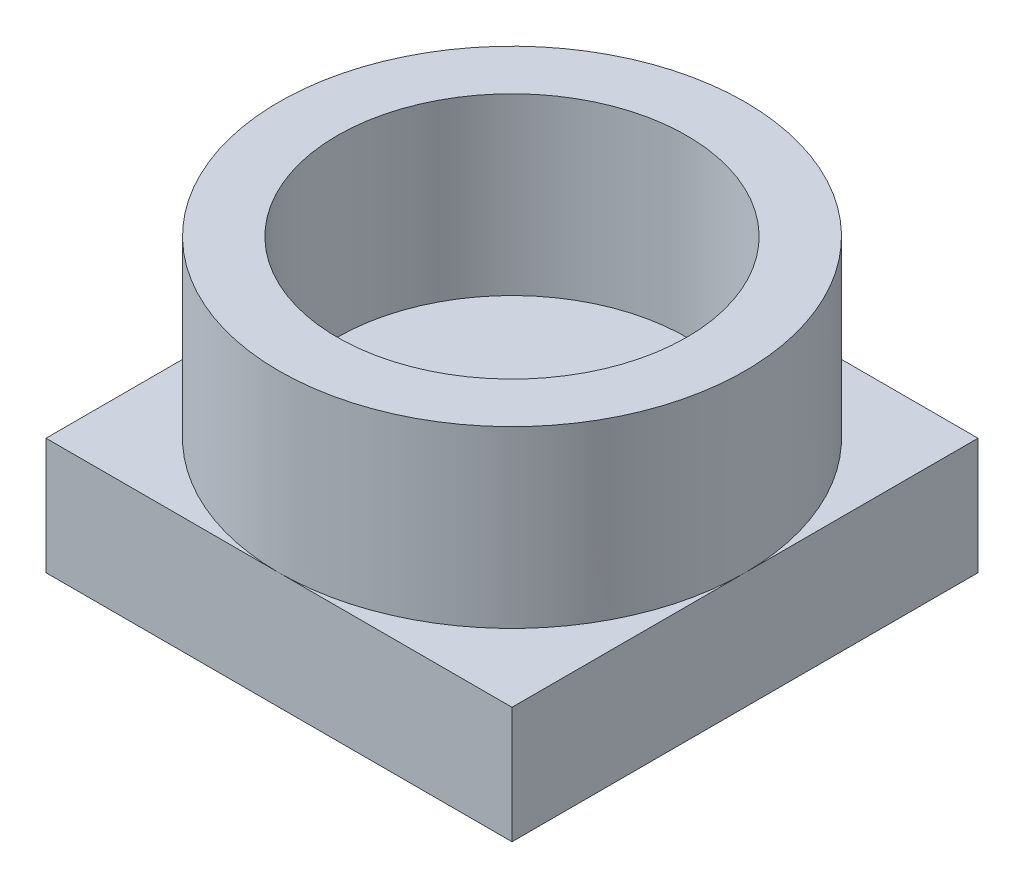
ISO-10303-21;
HEADER;
FILE_DESCRIPTION(('STEP AP214'),'2;1');
FILE_NAME('part.step','',(''),(''),'','','');
FILE_SCHEMA(('AUTOMOTIVE_DESIGN { 1 0 10303 214 1 1 1 1 }'));
ENDSEC;
DATA;
#1=APPLICATION_CONTEXT('core data for automotive mechanical design processes');
#2=APPLICATION_PROTOCOL_DEFINITION('international standard','automotive_design',2000,#1);
#3=PRODUCT_CONTEXT('',#1,'mechanical');
#4=PRODUCT('Part','Part','',(#3));
#5=PRODUCT_RELATED_PRODUCT_CATEGORY('part','',(#4));
#6=PRODUCT_DEFINITION_FORMATION('','',#4);
#7=PRODUCT_DEFINITION_CONTEXT('part definition',#1,'design');
#8=PRODUCT_DEFINITION('design','',#6,#7);
#9=PRODUCT_DEFINITION_SHAPE('','',#8);
#10=(LENGTH_UNIT() NAMED_UNIT(*) SI_UNIT(.MILLI.,.METRE.));
#11=(NAMED_UNIT(*) PLANE_ANGLE_UNIT() SI_UNIT($,.RADIAN.));
#12=(NAMED_UNIT(*) SI_UNIT($,.STERADIAN.) SOLID_ANGLE_UNIT());
#13=UNCERTAINTY_MEASURE_WITH_UNIT(LENGTH_MEASURE(1.E-05),#10,'distance_accuracy_value','');
#14=(GEOMETRIC_REPRESENTATION_CONTEXT(3) GLOBAL_UNCERTAINTY_ASSIGNED_CONTEXT((#13)) GLOBAL_UNIT_ASSIGNED_CONTEXT((#10,
#11,#12)) REPRESENTATION_CONTEXT('',''));
#15=CARTESIAN_POINT('',(0.,0.,0.));
#16=DIRECTION('',(0.,0.,1.));
#17=DIRECTION('',(1.,0.,0.));
#18=AXIS2_PLACEMENT_3D('',#15,#16,#17);
#19=CARTESIAN_POINT('',(0.,2.,0.));
#20=DIRECTION('',(0.,-1.,0.));
#21=DIRECTION('',(0.,0.,-1.));
#22=AXIS2_PLACEMENT_3D('',#19,#20,#21);
#23=PLANE('',#22);
#24=CARTESIAN_POINT('',(0.,2.,0.));
#25=DIRECTION('',(0.,1.,0.));
#26=DIRECTION('',(0.,0.,1.));
#27=AXIS2_PLACEMENT_3D('',#24,#25,#26);
#28=CIRCLE('',#27,4.);
#29=CARTESIAN_POINT('',(0.,2.,4.));
#30=VERTEX_POINT('',#29);
#31=CARTESIAN_POINT('',(4.,2.,0.));
#32=VERTEX_POINT('',#31);
#33=EDGE_CURVE('E53',#30,#32,#28,.T.);
#34=ORIENTED_EDGE('',*,*,#33,.F.);
#35=DIRECTION('',(1.,0.,0.));
#36=VECTOR('',#35,1.);
#37=CARTESIAN_POINT('',(-4.,2.,4.));
#38=LINE('',#37,#36);
#39=CARTESIAN_POINT('',(4.,2.,4.));
#40=VERTEX_POINT('',#39);
#41=EDGE_CURVE('E104',#30,#40,#38,.T.);
#42=ORIENTED_EDGE('',*,*,#41,.T.);
#43=DIRECTION('',(0.,0.,-1.));
#44=VECTOR('',#43,1.);
#45=CARTESIAN_POINT('',(4.,2.,4.));
#46=LINE('',#45,#44);
#47=EDGE_CURVE('E115',#40,#32,#46,.T.);
#48=ORIENTED_EDGE('',*,*,#47,.T.);
#49=EDGE_LOOP('',(#34,#42,#48));
#50=FACE_BOUND('',#49,.T.);
#51=ADVANCED_FACE('F42',(#50),#23,.F.);
#52=CARTESIAN_POINT('',(0.,2.,-4.));
#53=VERTEX_POINT('',#52);
#54=EDGE_CURVE('E12',#32,#53,#28,.T.);
#55=ORIENTED_EDGE('',*,*,#54,.F.);
#56=CARTESIAN_POINT('',(4.,2.,-4.));
#57=VERTEX_POINT('',#56);
#58=EDGE_CURVE('E127',#32,#57,#46,.T.);
#59=ORIENTED_EDGE('',*,*,#58,.T.);
#60=DIRECTION('',(-1.,0.,0.));
#61=VECTOR('',#60,1.);
#62=CARTESIAN_POINT('',(-4.,2.,-4.));
#63=LINE('',#62,#61);
#64=EDGE_CURVE('E128',#57,#53,#63,.T.);
#65=ORIENTED_EDGE('',*,*,#64,.T.);
#66=EDGE_LOOP('',(#55,#59,#65));
#67=FACE_BOUND('',#66,.T.);
#68=ADVANCED_FACE('F159',(#67),#23,.F.);
#69=CARTESIAN_POINT('',(-4.,2.,0.));
#70=VERTEX_POINT('',#69);
#71=EDGE_CURVE('E51',#53,#70,#28,.T.);
#72=ORIENTED_EDGE('',*,*,#71,.F.);
#73=CARTESIAN_POINT('',(-4.,2.,-4.));
#74=VERTEX_POINT('',#73);
#75=EDGE_CURVE('E126',#53,#74,#63,.T.);
#76=ORIENTED_EDGE('',*,*,#75,.T.);
#77=DIRECTION('',(0.,0.,1.));
#78=VECTOR('',#77,1.);
#79=CARTESIAN_POINT('',(-4.,2.,4.));
#80=LINE('',#79,#78);
#81=EDGE_CURVE('E113',#74,#70,#80,.T.);
#82=ORIENTED_EDGE('',*,*,#81,.T.);
#83=EDGE_LOOP('',(#72,#76,#82));
#84=FACE_BOUND('',#83,.T.);
#85=ADVANCED_FACE('F161',(#84),#23,.F.);
#86=CARTESIAN_POINT('',(4.,2.,4.));
#87=DIRECTION('',(-1.,0.,0.));
#88=DIRECTION('',(0.,0.,1.));
#89=AXIS2_PLACEMENT_3D('',#86,#87,#88);
#90=PLANE('',#89);
#91=DIRECTION('',(0.,0.,-1.));
#92=VECTOR('',#91,1.);
#93=CARTESIAN_POINT('',(4.,0.,4.));
#94=LINE('',#93,#92);
#95=CARTESIAN_POINT('',(4.,0.,4.));
#96=VERTEX_POINT('',#95);
#97=CARTESIAN_POINT('',(4.,0.,-4.));
#98=VERTEX_POINT('',#97);
#99=EDGE_CURVE('E132',#96,#98,#94,.T.);
#100=ORIENTED_EDGE('',*,*,#99,.T.);
#101=DIRECTION('',(0.,-1.,0.));
#102=VECTOR('',#101,1.);
#103=CARTESIAN_POINT('',(4.,2.,-4.));
#104=LINE('',#103,#102);
#105=EDGE_CURVE('E46',#57,#98,#104,.T.);
#106=ORIENTED_EDGE('',*,*,#105,.F.);
#107=ORIENTED_EDGE('',*,*,#58,.F.);
#108=ORIENTED_EDGE('',*,*,#47,.F.);
#109=DIRECTION('',(0.,-1.,0.));
#110=VECTOR('',#109,1.);
#111=CARTESIAN_POINT('',(4.,2.,4.));
#112=LINE('',#111,#110);
#113=EDGE_CURVE('E103',#40,#96,#112,.T.);
#114=ORIENTED_EDGE('',*,*,#113,.T.);
#115=EDGE_LOOP('',(#100,#106,#107,#108,#114));
#116=FACE_BOUND('',#115,.T.);
#117=ADVANCED_FACE('F44',(#116),#90,.F.);
#118=CARTESIAN_POINT('',(-4.,2.,-4.));
#119=DIRECTION('',(0.,0.,1.));
#120=DIRECTION('',(1.,0.,0.));
#121=AXIS2_PLACEMENT_3D('',#118,#119,#120);
#122=PLANE('',#121);
#123=DIRECTION('',(-1.,0.,0.));
#124=VECTOR('',#123,1.);
#125=CARTESIAN_POINT('',(-4.,0.,-4.));
#126=LINE('',#125,#124);
#127=CARTESIAN_POINT('',(-4.,0.,-4.));
#128=VERTEX_POINT('',#127);
#129=EDGE_CURVE('E135',#98,#128,#126,.T.);
#130=ORIENTED_EDGE('',*,*,#129,.T.);
#131=DIRECTION('',(0.,-1.,0.));
#132=VECTOR('',#131,1.);
#133=CARTESIAN_POINT('',(-4.,2.,-4.));
#134=LINE('',#133,#132);
#135=EDGE_CURVE('E121',#74,#128,#134,.T.);
#136=ORIENTED_EDGE('',*,*,#135,.F.);
#137=ORIENTED_EDGE('',*,*,#75,.F.);
#138=ORIENTED_EDGE('',*,*,#64,.F.);
#139=ORIENTED_EDGE('',*,*,#105,.T.);
#140=EDGE_LOOP('',(#130,#136,#137,#138,#139));
#141=FACE_BOUND('',#140,.T.);
#142=ADVANCED_FACE('F160',(#141),#122,.F.);
#143=CARTESIAN_POINT('',(-4.,2.,4.));
#144=DIRECTION('',(1.,0.,0.));
#145=DIRECTION('',(0.,0.,-1.));
#146=AXIS2_PLACEMENT_3D('',#143,#144,#145);
#147=PLANE('',#146);
#148=DIRECTION('',(0.,0.,1.));
#149=VECTOR('',#148,1.);
#150=CARTESIAN_POINT('',(-4.,0.,4.));
#151=LINE('',#150,#149);
#152=CARTESIAN_POINT('',(-4.,0.,4.));
#153=VERTEX_POINT('',#152);
#154=EDGE_CURVE('E137',#128,#153,#151,.T.);
#155=ORIENTED_EDGE('',*,*,#154,.T.);
#156=DIRECTION('',(0.,-1.,0.));
#157=VECTOR('',#156,1.);
#158=CARTESIAN_POINT('',(-4.,2.,4.));
#159=LINE('',#158,#157);
#160=CARTESIAN_POINT('',(-4.,2.,4.));
#161=VERTEX_POINT('',#160);
#162=EDGE_CURVE('E142',#161,#153,#159,.T.);
#163=ORIENTED_EDGE('',*,*,#162,.F.);
#164=EDGE_CURVE('E99',#70,#161,#80,.T.);
#165=ORIENTED_EDGE('',*,*,#164,.F.);
#166=ORIENTED_EDGE('',*,*,#81,.F.);
#167=ORIENTED_EDGE('',*,*,#135,.T.);
#168=EDGE_LOOP('',(#155,#163,#165,#166,#167));
#169=FACE_BOUND('',#168,.T.);
#170=ADVANCED_FACE('F148',(#169),#147,.F.);
#171=CARTESIAN_POINT('',(-4.,2.,4.));
#172=DIRECTION('',(0.,0.,-1.));
#173=DIRECTION('',(-1.,0.,0.));
#174=AXIS2_PLACEMENT_3D('',#171,#172,#173);
#175=PLANE('',#174);
#176=DIRECTION('',(1.,0.,0.));
#177=VECTOR('',#176,1.);
#178=CARTESIAN_POINT('',(-4.,0.,4.));
#179=LINE('',#178,#177);
#180=EDGE_CURVE('E139',#153,#96,#179,.T.);
#181=ORIENTED_EDGE('',*,*,#180,.T.);
#182=ORIENTED_EDGE('',*,*,#113,.F.);
#183=ORIENTED_EDGE('',*,*,#41,.F.);
#184=EDGE_CURVE('E96',#161,#30,#38,.T.);
#185=ORIENTED_EDGE('',*,*,#184,.F.);
#186=ORIENTED_EDGE('',*,*,#162,.T.);
#187=EDGE_LOOP('',(#181,#182,#183,#185,#186));
#188=FACE_BOUND('',#187,.T.);
#189=ADVANCED_FACE('F108',(#188),#175,.F.);
#190=EDGE_CURVE('E60',#70,#30,#28,.T.);
#191=ORIENTED_EDGE('',*,*,#190,.F.);
#192=ORIENTED_EDGE('',*,*,#164,.T.);
#193=ORIENTED_EDGE('',*,*,#184,.T.);
#194=EDGE_LOOP('',(#191,#192,#193));
#195=FACE_BOUND('',#194,.T.);
#196=ADVANCED_FACE('F98',(#195),#23,.F.);
#197=CARTESIAN_POINT('',(0.,0.,0.));
#198=DIRECTION('',(0.,-1.,0.));
#199=DIRECTION('',(0.,0.,-1.));
#200=AXIS2_PLACEMENT_3D('',#197,#198,#199);
#201=PLANE('',#200);
#202=ORIENTED_EDGE('',*,*,#99,.F.);
#203=ORIENTED_EDGE('',*,*,#180,.F.);
#204=ORIENTED_EDGE('',*,*,#154,.F.);
#205=ORIENTED_EDGE('',*,*,#129,.F.);
#206=EDGE_LOOP('',(#202,#203,#204,#205));
#207=FACE_BOUND('',#206,.T.);
#208=ADVANCED_FACE('F153',(#207),#201,.T.);
#209=CARTESIAN_POINT('',(0.,5.,0.));
#210=DIRECTION('',(0.,1.,0.));
#211=DIRECTION('',(0.,0.,1.));
#212=AXIS2_PLACEMENT_3D('',#209,#210,#211);
#213=PLANE('',#212);
#214=CARTESIAN_POINT('',(0.,5.,0.));
#215=DIRECTION('',(0.,1.,0.));
#216=DIRECTION('',(0.,0.,1.));
#217=AXIS2_PLACEMENT_3D('',#214,#215,#216);
#218=CIRCLE('',#217,4.);
#219=CARTESIAN_POINT('',(0.,5.,4.));
#220=VERTEX_POINT('',#219);
#221=EDGE_CURVE('E117',#220,#220,#218,.T.);
#222=ORIENTED_EDGE('',*,*,#221,.T.);
#223=EDGE_LOOP('',(#222));
#224=FACE_BOUND('',#223,.T.);
#225=CARTESIAN_POINT('',(0.,5.,0.));
#226=DIRECTION('',(0.,1.,0.));
#227=DIRECTION('',(1.,0.,0.));
#228=AXIS2_PLACEMENT_3D('',#225,#226,#227);
#229=CIRCLE('',#228,3.);
#230=CARTESIAN_POINT('',(3.,5.,0.));
#231=VERTEX_POINT('',#230);
#232=EDGE_CURVE('E118',#231,#231,#229,.T.);
#233=ORIENTED_EDGE('',*,*,#232,.F.);
#234=EDGE_LOOP('',(#233));
#235=FACE_BOUND('',#234,.T.);
#236=ADVANCED_FACE('F182',(#224,#235),#213,.T.);
#237=CARTESIAN_POINT('',(0.,5.,0.));
#238=DIRECTION('',(0.,-1.,0.));
#239=DIRECTION('',(0.,0.,-1.));
#240=AXIS2_PLACEMENT_3D('',#237,#238,#239);
#241=CYLINDRICAL_SURFACE('',#240,4.);
#242=ORIENTED_EDGE('',*,*,#221,.F.);
#243=EDGE_LOOP('',(#242));
#244=FACE_BOUND('',#243,.T.);
#245=ORIENTED_EDGE('',*,*,#33,.T.);
#246=ORIENTED_EDGE('',*,*,#54,.T.);
#247=ORIENTED_EDGE('',*,*,#71,.T.);
#248=ORIENTED_EDGE('',*,*,#190,.T.);
#249=EDGE_LOOP('',(#245,#246,#247,#248));
#250=FACE_BOUND('',#249,.T.);
#251=ADVANCED_FACE('F119',(#244,#250),#241,.T.);
#252=CARTESIAN_POINT('',(0.,5.,0.));
#253=DIRECTION('',(0.,-1.,0.));
#254=DIRECTION('',(0.,0.,-1.));
#255=AXIS2_PLACEMENT_3D('',#252,#253,#254);
#256=CYLINDRICAL_SURFACE('',#255,3.);
#257=ORIENTED_EDGE('',*,*,#232,.T.);
#258=EDGE_LOOP('',(#257));
#259=FACE_BOUND('',#258,.T.);
#260=CARTESIAN_POINT('',(0.,2.,0.));
#261=DIRECTION('',(0.,1.,0.));
#262=DIRECTION('',(1.,0.,0.));
#263=AXIS2_PLACEMENT_3D('',#260,#261,#262);
#264=CIRCLE('',#263,3.);
#265=CARTESIAN_POINT('',(3.,2.,0.));
#266=VERTEX_POINT('',#265);
#267=EDGE_CURVE('E272',#266,#266,#264,.T.);
#268=ORIENTED_EDGE('',*,*,#267,.F.);
#269=EDGE_LOOP('',(#268));
#270=FACE_BOUND('',#269,.T.);
#271=ADVANCED_FACE('F172',(#259,#270),#256,.F.);
#272=ORIENTED_EDGE('',*,*,#267,.T.);
#273=EDGE_LOOP('',(#272));
#274=FACE_BOUND('',#273,.T.);
#275=ADVANCED_FACE('F164',(#274),#23,.F.);
#276=CLOSED_SHELL('',(#51,#68,#85,#117,#142,#170,#189,#196,#208,#236,#251,#271,#275));
#277=MANIFOLD_SOLID_BREP('B2',#276);
#278=ADVANCED_BREP_SHAPE_REPRESENTATION('',(#18,#277),#14);
#279=SHAPE_DEFINITION_REPRESENTATION(#9,#278);
ENDSEC;
END-ISO-10303-21;
